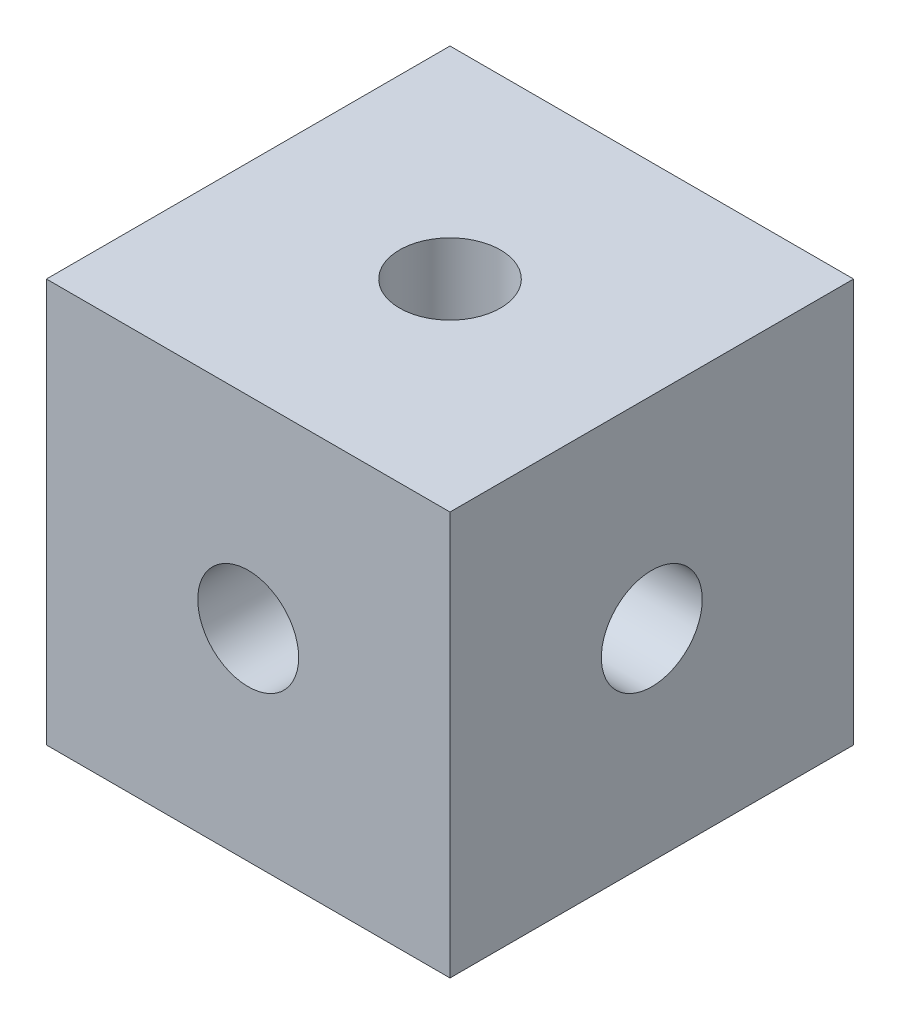
ISO-10303-21;
HEADER;
FILE_DESCRIPTION(('STEP AP214'),'2;1');
FILE_NAME('part.step','',(''),(''),'','','');
FILE_SCHEMA(('AUTOMOTIVE_DESIGN { 1 0 10303 214 1 1 1 1 }'));
ENDSEC;
DATA;
#1=APPLICATION_CONTEXT('core data for automotive mechanical design processes');
#2=APPLICATION_PROTOCOL_DEFINITION('international standard','automotive_design',2000,#1);
#3=PRODUCT_CONTEXT('',#1,'mechanical');
#4=PRODUCT('Part','Part','',(#3));
#5=PRODUCT_RELATED_PRODUCT_CATEGORY('part','',(#4));
#6=PRODUCT_DEFINITION_FORMATION('','',#4);
#7=PRODUCT_DEFINITION_CONTEXT('part definition',#1,'design');
#8=PRODUCT_DEFINITION('design','',#6,#7);
#9=PRODUCT_DEFINITION_SHAPE('','',#8);
#10=(LENGTH_UNIT() NAMED_UNIT(*) SI_UNIT(.MILLI.,.METRE.));
#11=(NAMED_UNIT(*) PLANE_ANGLE_UNIT() SI_UNIT($,.RADIAN.));
#12=(NAMED_UNIT(*) SI_UNIT($,.STERADIAN.) SOLID_ANGLE_UNIT());
#13=UNCERTAINTY_MEASURE_WITH_UNIT(LENGTH_MEASURE(1.E-05),#10,'distance_accuracy_value','');
#14=(GEOMETRIC_REPRESENTATION_CONTEXT(3) GLOBAL_UNCERTAINTY_ASSIGNED_CONTEXT((#13)) GLOBAL_UNIT_ASSIGNED_CONTEXT((#10,
#11,#12)) REPRESENTATION_CONTEXT('',''));
#15=CARTESIAN_POINT('',(0.,0.,0.));
#16=DIRECTION('',(0.,0.,1.));
#17=DIRECTION('',(1.,0.,0.));
#18=AXIS2_PLACEMENT_3D('',#15,#16,#17);
#19=CARTESIAN_POINT('',(5.,0.,0.));
#20=DIRECTION('',(1.,0.,0.));
#21=DIRECTION('',(0.,0.,-1.));
#22=AXIS2_PLACEMENT_3D('',#19,#20,#21);
#23=CYLINDRICAL_SURFACE('',#22,1.25);
#24=CARTESIAN_POINT('',(5.,0.,0.));
#25=DIRECTION('',(1.,0.,0.));
#26=DIRECTION('',(0.,0.,-1.));
#27=AXIS2_PLACEMENT_3D('',#24,#25,#26);
#28=CIRCLE('',#27,1.25);
#29=CARTESIAN_POINT('',(5.,0.,-1.25));
#30=VERTEX_POINT('',#29);
#31=EDGE_CURVE('E156',#30,#30,#28,.T.);
#32=ORIENTED_EDGE('',*,*,#31,.T.);
#33=EDGE_LOOP('',(#32));
#34=FACE_BOUND('',#33,.T.);
#35=CARTESIAN_POINT('',(0.,0.,0.));
#36=DIRECTION('',(0.707106781186547,-0.707106781186547,0.));
#37=DIRECTION('',(0.707106781186547,0.707106781186547,0.));
#38=AXIS2_PLACEMENT_3D('',#35,#36,#37);
#39=ELLIPSE('',#38,1.76776695296637,1.25);
#40=CARTESIAN_POINT('',(0.883883476483183,0.883883476483183,0.883883476483183));
#41=VERTEX_POINT('',#40);
#42=CARTESIAN_POINT('',(0.883883476483183,0.883883476483183,-0.883883476483183));
#43=VERTEX_POINT('',#42);
#44=EDGE_CURVE('E111',#41,#43,#39,.F.);
#45=ORIENTED_EDGE('',*,*,#44,.T.);
#46=CARTESIAN_POINT('',(0.,0.,0.));
#47=DIRECTION('',(0.707106781186547,0.,0.707106781186547));
#48=DIRECTION('',(0.707106781186547,0.,-0.707106781186547));
#49=AXIS2_PLACEMENT_3D('',#46,#47,#48);
#50=ELLIPSE('',#49,1.76776695296637,1.25);
#51=CARTESIAN_POINT('',(0.883883476483183,-0.883883476483183,-0.883883476483183));
#52=VERTEX_POINT('',#51);
#53=EDGE_CURVE('E100',#43,#52,#50,.F.);
#54=ORIENTED_EDGE('',*,*,#53,.T.);
#55=CARTESIAN_POINT('',(0.,0.,0.));
#56=DIRECTION('',(0.707106781186547,0.707106781186547,0.));
#57=DIRECTION('',(0.707106781186547,-0.707106781186547,0.));
#58=AXIS2_PLACEMENT_3D('',#55,#56,#57);
#59=ELLIPSE('',#58,1.76776695296637,1.25);
#60=CARTESIAN_POINT('',(0.883883476483183,-0.883883476483183,0.883883476483183));
#61=VERTEX_POINT('',#60);
#62=EDGE_CURVE('E106',#52,#61,#59,.F.);
#63=ORIENTED_EDGE('',*,*,#62,.T.);
#64=CARTESIAN_POINT('',(0.,0.,0.));
#65=DIRECTION('',(0.707106781186547,0.,-0.707106781186547));
#66=DIRECTION('',(0.707106781186547,0.,0.707106781186547));
#67=AXIS2_PLACEMENT_3D('',#64,#65,#66);
#68=ELLIPSE('',#67,1.76776695296637,1.25);
#69=EDGE_CURVE('E52',#61,#41,#68,.F.);
#70=ORIENTED_EDGE('',*,*,#69,.T.);
#71=EDGE_LOOP('',(#45,#54,#63,#70));
#72=FACE_BOUND('',#71,.T.);
#73=ADVANCED_FACE('F37',(#34,#72),#23,.F.);
#74=CARTESIAN_POINT('',(5.,5.,-5.));
#75=DIRECTION('',(-1.,0.,0.));
#76=DIRECTION('',(0.,0.,1.));
#77=AXIS2_PLACEMENT_3D('',#74,#75,#76);
#78=PLANE('',#77);
#79=DIRECTION('',(0.,0.,-1.));
#80=VECTOR('',#79,1.);
#81=CARTESIAN_POINT('',(5.,-5.,-5.));
#82=LINE('',#81,#80);
#83=CARTESIAN_POINT('',(5.,-5.,5.));
#84=VERTEX_POINT('',#83);
#85=CARTESIAN_POINT('',(5.,-5.,-5.));
#86=VERTEX_POINT('',#85);
#87=EDGE_CURVE('E139',#84,#86,#82,.T.);
#88=ORIENTED_EDGE('',*,*,#87,.T.);
#89=DIRECTION('',(0.,-1.,0.));
#90=VECTOR('',#89,1.);
#91=CARTESIAN_POINT('',(5.,5.,-5.));
#92=LINE('',#91,#90);
#93=CARTESIAN_POINT('',(5.,5.,-5.));
#94=VERTEX_POINT('',#93);
#95=EDGE_CURVE('E129',#94,#86,#92,.T.);
#96=ORIENTED_EDGE('',*,*,#95,.F.);
#97=DIRECTION('',(0.,0.,-1.));
#98=VECTOR('',#97,1.);
#99=CARTESIAN_POINT('',(5.,5.,-5.));
#100=LINE('',#99,#98);
#101=CARTESIAN_POINT('',(5.,5.,5.));
#102=VERTEX_POINT('',#101);
#103=EDGE_CURVE('E148',#102,#94,#100,.T.);
#104=ORIENTED_EDGE('',*,*,#103,.F.);
#105=DIRECTION('',(0.,-1.,0.));
#106=VECTOR('',#105,1.);
#107=CARTESIAN_POINT('',(5.,5.,5.));
#108=LINE('',#107,#106);
#109=EDGE_CURVE('E126',#102,#84,#108,.T.);
#110=ORIENTED_EDGE('',*,*,#109,.T.);
#111=EDGE_LOOP('',(#88,#96,#104,#110));
#112=FACE_BOUND('',#111,.T.);
#113=ORIENTED_EDGE('',*,*,#31,.F.);
#114=EDGE_LOOP('',(#113));
#115=FACE_BOUND('',#114,.T.);
#116=ADVANCED_FACE('F194',(#112,#115),#78,.F.);
#117=CARTESIAN_POINT('',(-5.,5.,-5.));
#118=DIRECTION('',(1.,0.,0.));
#119=DIRECTION('',(0.,0.,-1.));
#120=AXIS2_PLACEMENT_3D('',#117,#118,#119);
#121=PLANE('',#120);
#122=CARTESIAN_POINT('',(-5.,0.,0.));
#123=DIRECTION('',(1.,0.,0.));
#124=DIRECTION('',(0.,0.,-1.));
#125=AXIS2_PLACEMENT_3D('',#122,#123,#124);
#126=CIRCLE('',#125,1.25);
#127=CARTESIAN_POINT('',(-5.,0.,-1.25));
#128=VERTEX_POINT('',#127);
#129=EDGE_CURVE('E146',#128,#128,#126,.T.);
#130=ORIENTED_EDGE('',*,*,#129,.T.);
#131=EDGE_LOOP('',(#130));
#132=FACE_BOUND('',#131,.T.);
#133=DIRECTION('',(0.,0.,1.));
#134=VECTOR('',#133,1.);
#135=CARTESIAN_POINT('',(-5.,-5.,-5.));
#136=LINE('',#135,#134);
#137=CARTESIAN_POINT('',(-5.,-5.,-5.));
#138=VERTEX_POINT('',#137);
#139=CARTESIAN_POINT('',(-5.,-5.,5.));
#140=VERTEX_POINT('',#139);
#141=EDGE_CURVE('E143',#138,#140,#136,.T.);
#142=ORIENTED_EDGE('',*,*,#141,.T.);
#143=DIRECTION('',(0.,-1.,0.));
#144=VECTOR('',#143,1.);
#145=CARTESIAN_POINT('',(-5.,5.,5.));
#146=LINE('',#145,#144);
#147=CARTESIAN_POINT('',(-5.,5.,5.));
#148=VERTEX_POINT('',#147);
#149=EDGE_CURVE('E123',#148,#140,#146,.T.);
#150=ORIENTED_EDGE('',*,*,#149,.F.);
#151=DIRECTION('',(0.,0.,1.));
#152=VECTOR('',#151,1.);
#153=CARTESIAN_POINT('',(-5.,5.,-5.));
#154=LINE('',#153,#152);
#155=CARTESIAN_POINT('',(-5.,5.,-5.));
#156=VERTEX_POINT('',#155);
#157=EDGE_CURVE('E138',#156,#148,#154,.T.);
#158=ORIENTED_EDGE('',*,*,#157,.F.);
#159=DIRECTION('',(0.,-1.,0.));
#160=VECTOR('',#159,1.);
#161=CARTESIAN_POINT('',(-5.,5.,-5.));
#162=LINE('',#161,#160);
#163=EDGE_CURVE('E132',#156,#138,#162,.T.);
#164=ORIENTED_EDGE('',*,*,#163,.T.);
#165=EDGE_LOOP('',(#142,#150,#158,#164));
#166=FACE_BOUND('',#165,.T.);
#167=ADVANCED_FACE('F39',(#132,#166),#121,.F.);
#168=CARTESIAN_POINT('',(5.,5.,5.));
#169=DIRECTION('',(0.,0.,-1.));
#170=DIRECTION('',(-1.,0.,0.));
#171=AXIS2_PLACEMENT_3D('',#168,#169,#170);
#172=PLANE('',#171);
#173=CARTESIAN_POINT('',(0.,0.,5.));
#174=DIRECTION('',(0.,0.,1.));
#175=DIRECTION('',(1.,0.,0.));
#176=AXIS2_PLACEMENT_3D('',#173,#174,#175);
#177=CIRCLE('',#176,1.25);
#178=CARTESIAN_POINT('',(1.25,0.,5.));
#179=VERTEX_POINT('',#178);
#180=EDGE_CURVE('E177',#179,#179,#177,.T.);
#181=ORIENTED_EDGE('',*,*,#180,.F.);
#182=EDGE_LOOP('',(#181));
#183=FACE_BOUND('',#182,.T.);
#184=DIRECTION('',(1.,0.,0.));
#185=VECTOR('',#184,1.);
#186=CARTESIAN_POINT('',(5.,-5.,5.));
#187=LINE('',#186,#185);
#188=EDGE_CURVE('E141',#140,#84,#187,.T.);
#189=ORIENTED_EDGE('',*,*,#188,.T.);
#190=ORIENTED_EDGE('',*,*,#109,.F.);
#191=DIRECTION('',(1.,0.,0.));
#192=VECTOR('',#191,1.);
#193=CARTESIAN_POINT('',(5.,5.,5.));
#194=LINE('',#193,#192);
#195=EDGE_CURVE('E150',#148,#102,#194,.T.);
#196=ORIENTED_EDGE('',*,*,#195,.F.);
#197=ORIENTED_EDGE('',*,*,#149,.T.);
#198=EDGE_LOOP('',(#189,#190,#196,#197));
#199=FACE_BOUND('',#198,.T.);
#200=ADVANCED_FACE('F183',(#183,#199),#172,.F.);
#201=CARTESIAN_POINT('',(5.,5.,-5.));
#202=DIRECTION('',(0.,0.,1.));
#203=DIRECTION('',(1.,0.,0.));
#204=AXIS2_PLACEMENT_3D('',#201,#202,#203);
#205=PLANE('',#204);
#206=CARTESIAN_POINT('',(0.,0.,-5.));
#207=DIRECTION('',(0.,0.,1.));
#208=DIRECTION('',(1.,0.,0.));
#209=AXIS2_PLACEMENT_3D('',#206,#207,#208);
#210=CIRCLE('',#209,1.25);
#211=CARTESIAN_POINT('',(1.25,0.,-5.));
#212=VERTEX_POINT('',#211);
#213=EDGE_CURVE('E174',#212,#212,#210,.T.);
#214=ORIENTED_EDGE('',*,*,#213,.T.);
#215=EDGE_LOOP('',(#214));
#216=FACE_BOUND('',#215,.T.);
#217=DIRECTION('',(-1.,0.,0.));
#218=VECTOR('',#217,1.);
#219=CARTESIAN_POINT('',(5.,-5.,-5.));
#220=LINE('',#219,#218);
#221=EDGE_CURVE('E136',#86,#138,#220,.T.);
#222=ORIENTED_EDGE('',*,*,#221,.T.);
#223=ORIENTED_EDGE('',*,*,#163,.F.);
#224=DIRECTION('',(-1.,0.,0.));
#225=VECTOR('',#224,1.);
#226=CARTESIAN_POINT('',(5.,5.,-5.));
#227=LINE('',#226,#225);
#228=EDGE_CURVE('E135',#94,#156,#227,.T.);
#229=ORIENTED_EDGE('',*,*,#228,.F.);
#230=ORIENTED_EDGE('',*,*,#95,.T.);
#231=EDGE_LOOP('',(#222,#223,#229,#230));
#232=FACE_BOUND('',#231,.T.);
#233=ADVANCED_FACE('F186',(#216,#232),#205,.F.);
#234=CARTESIAN_POINT('',(0.,5.,0.));
#235=DIRECTION('',(0.,-1.,0.));
#236=DIRECTION('',(0.,0.,-1.));
#237=AXIS2_PLACEMENT_3D('',#234,#235,#236);
#238=PLANE('',#237);
#239=CARTESIAN_POINT('',(0.,5.,0.));
#240=DIRECTION('',(0.,1.,0.));
#241=DIRECTION('',(0.,0.,1.));
#242=AXIS2_PLACEMENT_3D('',#239,#240,#241);
#243=CIRCLE('',#242,1.25);
#244=CARTESIAN_POINT('',(0.,5.,1.25));
#245=VERTEX_POINT('',#244);
#246=EDGE_CURVE('E162',#245,#245,#243,.T.);
#247=ORIENTED_EDGE('',*,*,#246,.F.);
#248=EDGE_LOOP('',(#247));
#249=FACE_BOUND('',#248,.T.);
#250=ORIENTED_EDGE('',*,*,#157,.T.);
#251=ORIENTED_EDGE('',*,*,#195,.T.);
#252=ORIENTED_EDGE('',*,*,#103,.T.);
#253=ORIENTED_EDGE('',*,*,#228,.T.);
#254=EDGE_LOOP('',(#250,#251,#252,#253));
#255=FACE_BOUND('',#254,.T.);
#256=ADVANCED_FACE('F205',(#249,#255),#238,.F.);
#257=CARTESIAN_POINT('',(0.,-5.,0.));
#258=DIRECTION('',(0.,-1.,0.));
#259=DIRECTION('',(0.,0.,-1.));
#260=AXIS2_PLACEMENT_3D('',#257,#258,#259);
#261=PLANE('',#260);
#262=CARTESIAN_POINT('',(0.,-5.,0.));
#263=DIRECTION('',(0.,1.,0.));
#264=DIRECTION('',(0.,0.,1.));
#265=AXIS2_PLACEMENT_3D('',#262,#263,#264);
#266=CIRCLE('',#265,1.25);
#267=CARTESIAN_POINT('',(0.,-5.,1.25));
#268=VERTEX_POINT('',#267);
#269=EDGE_CURVE('E159',#268,#268,#266,.T.);
#270=ORIENTED_EDGE('',*,*,#269,.T.);
#271=EDGE_LOOP('',(#270));
#272=FACE_BOUND('',#271,.T.);
#273=ORIENTED_EDGE('',*,*,#141,.F.);
#274=ORIENTED_EDGE('',*,*,#221,.F.);
#275=ORIENTED_EDGE('',*,*,#87,.F.);
#276=ORIENTED_EDGE('',*,*,#188,.F.);
#277=EDGE_LOOP('',(#273,#274,#275,#276));
#278=FACE_BOUND('',#277,.T.);
#279=ADVANCED_FACE('F198',(#272,#278),#261,.T.);
#280=CARTESIAN_POINT('',(0.,0.,0.));
#281=DIRECTION('',(0.707106781186547,0.707106781186547,0.));
#282=DIRECTION('',(0.707106781186547,-0.707106781186547,0.));
#283=AXIS2_PLACEMENT_3D('',#280,#281,#282);
#284=ELLIPSE('',#283,1.76776695296637,1.25);
#285=CARTESIAN_POINT('',(-0.883883476483183,0.883883476483183,-0.883883476483183));
#286=VERTEX_POINT('',#285);
#287=CARTESIAN_POINT('',(-0.883883476483183,0.883883476483183,0.883883476483183));
#288=VERTEX_POINT('',#287);
#289=EDGE_CURVE('E115',#286,#288,#284,.T.);
#290=ORIENTED_EDGE('',*,*,#289,.T.);
#291=CARTESIAN_POINT('',(0.,0.,0.));
#292=DIRECTION('',(0.707106781186547,0.,0.707106781186547));
#293=DIRECTION('',(0.707106781186547,0.,-0.707106781186547));
#294=AXIS2_PLACEMENT_3D('',#291,#292,#293);
#295=ELLIPSE('',#294,1.76776695296637,1.25);
#296=CARTESIAN_POINT('',(-0.883883476483183,-0.883883476483183,0.883883476483183));
#297=VERTEX_POINT('',#296);
#298=EDGE_CURVE('E169',#288,#297,#295,.T.);
#299=ORIENTED_EDGE('',*,*,#298,.T.);
#300=CARTESIAN_POINT('',(0.,0.,0.));
#301=DIRECTION('',(0.707106781186547,-0.707106781186547,0.));
#302=DIRECTION('',(0.707106781186547,0.707106781186547,0.));
#303=AXIS2_PLACEMENT_3D('',#300,#301,#302);
#304=ELLIPSE('',#303,1.76776695296637,1.25);
#305=CARTESIAN_POINT('',(-0.883883476483183,-0.883883476483183,-0.883883476483183));
#306=VERTEX_POINT('',#305);
#307=EDGE_CURVE('E118',#297,#306,#304,.T.);
#308=ORIENTED_EDGE('',*,*,#307,.T.);
#309=CARTESIAN_POINT('',(0.,0.,0.));
#310=DIRECTION('',(0.707106781186547,0.,-0.707106781186547));
#311=DIRECTION('',(0.707106781186547,0.,0.707106781186547));
#312=AXIS2_PLACEMENT_3D('',#309,#310,#311);
#313=ELLIPSE('',#312,1.76776695296637,1.25);
#314=EDGE_CURVE('E59',#306,#286,#313,.T.);
#315=ORIENTED_EDGE('',*,*,#314,.T.);
#316=EDGE_LOOP('',(#290,#299,#308,#315));
#317=FACE_BOUND('',#316,.T.);
#318=ORIENTED_EDGE('',*,*,#129,.F.);
#319=EDGE_LOOP('',(#318));
#320=FACE_BOUND('',#319,.T.);
#321=ADVANCED_FACE('F213',(#317,#320),#23,.F.);
#322=CARTESIAN_POINT('',(0.,5.,0.));
#323=DIRECTION('',(0.,1.,0.));
#324=DIRECTION('',(0.,0.,1.));
#325=AXIS2_PLACEMENT_3D('',#322,#323,#324);
#326=CYLINDRICAL_SURFACE('',#325,1.25);
#327=ORIENTED_EDGE('',*,*,#246,.T.);
#328=EDGE_LOOP('',(#327));
#329=FACE_BOUND('',#328,.T.);
#330=ORIENTED_EDGE('',*,*,#289,.F.);
#331=CARTESIAN_POINT('',(0.,0.,0.));
#332=DIRECTION('',(0.,0.707106781186547,0.707106781186547));
#333=DIRECTION('',(0.,0.707106781186547,-0.707106781186547));
#334=AXIS2_PLACEMENT_3D('',#331,#332,#333);
#335=ELLIPSE('',#334,1.76776695296637,1.25);
#336=EDGE_CURVE('E112',#286,#43,#335,.F.);
#337=ORIENTED_EDGE('',*,*,#336,.T.);
#338=ORIENTED_EDGE('',*,*,#44,.F.);
#339=CARTESIAN_POINT('',(0.,0.,0.));
#340=DIRECTION('',(0.,0.707106781186547,-0.707106781186547));
#341=DIRECTION('',(0.,0.707106781186547,0.707106781186547));
#342=AXIS2_PLACEMENT_3D('',#339,#340,#341);
#343=ELLIPSE('',#342,1.76776695296637,1.25);
#344=EDGE_CURVE('E165',#41,#288,#343,.F.);
#345=ORIENTED_EDGE('',*,*,#344,.T.);
#346=EDGE_LOOP('',(#330,#337,#338,#345));
#347=FACE_BOUND('',#346,.T.);
#348=ADVANCED_FACE('F228',(#329,#347),#326,.F.);
#349=ORIENTED_EDGE('',*,*,#269,.F.);
#350=EDGE_LOOP('',(#349));
#351=FACE_BOUND('',#350,.T.);
#352=ORIENTED_EDGE('',*,*,#307,.F.);
#353=CARTESIAN_POINT('',(0.,0.,0.));
#354=DIRECTION('',(0.,0.707106781186547,0.707106781186547));
#355=DIRECTION('',(0.,0.707106781186547,-0.707106781186547));
#356=AXIS2_PLACEMENT_3D('',#353,#354,#355);
#357=ELLIPSE('',#356,1.76776695296637,1.25);
#358=EDGE_CURVE('E11',#297,#61,#357,.T.);
#359=ORIENTED_EDGE('',*,*,#358,.T.);
#360=ORIENTED_EDGE('',*,*,#62,.F.);
#361=CARTESIAN_POINT('',(0.,0.,0.));
#362=DIRECTION('',(0.,0.707106781186547,-0.707106781186547));
#363=DIRECTION('',(0.,0.707106781186547,0.707106781186547));
#364=AXIS2_PLACEMENT_3D('',#361,#362,#363);
#365=ELLIPSE('',#364,1.76776695296637,1.25);
#366=EDGE_CURVE('E45',#52,#306,#365,.T.);
#367=ORIENTED_EDGE('',*,*,#366,.T.);
#368=EDGE_LOOP('',(#352,#359,#360,#367));
#369=FACE_BOUND('',#368,.T.);
#370=ADVANCED_FACE('F114',(#351,#369),#326,.F.);
#371=CARTESIAN_POINT('',(0.,0.,5.));
#372=DIRECTION('',(0.,0.,1.));
#373=DIRECTION('',(1.,0.,0.));
#374=AXIS2_PLACEMENT_3D('',#371,#372,#373);
#375=CYLINDRICAL_SURFACE('',#374,1.25);
#376=ORIENTED_EDGE('',*,*,#213,.F.);
#377=EDGE_LOOP('',(#376));
#378=FACE_BOUND('',#377,.T.);
#379=ORIENTED_EDGE('',*,*,#314,.F.);
#380=ORIENTED_EDGE('',*,*,#366,.F.);
#381=ORIENTED_EDGE('',*,*,#53,.F.);
#382=ORIENTED_EDGE('',*,*,#336,.F.);
#383=EDGE_LOOP('',(#379,#380,#381,#382));
#384=FACE_BOUND('',#383,.T.);
#385=ADVANCED_FACE('F99',(#378,#384),#375,.F.);
#386=ORIENTED_EDGE('',*,*,#180,.T.);
#387=EDGE_LOOP('',(#386));
#388=FACE_BOUND('',#387,.T.);
#389=ORIENTED_EDGE('',*,*,#69,.F.);
#390=ORIENTED_EDGE('',*,*,#358,.F.);
#391=ORIENTED_EDGE('',*,*,#298,.F.);
#392=ORIENTED_EDGE('',*,*,#344,.F.);
#393=EDGE_LOOP('',(#389,#390,#391,#392));
#394=FACE_BOUND('',#393,.T.);
#395=ADVANCED_FACE('F181',(#388,#394),#375,.F.);
#396=CLOSED_SHELL('',(#73,#116,#167,#200,#233,#256,#279,#321,#348,#370,#385,#395));
#397=MANIFOLD_SOLID_BREP('B2',#396);
#398=ADVANCED_BREP_SHAPE_REPRESENTATION('',(#18,#397),#14);
#399=SHAPE_DEFINITION_REPRESENTATION(#9,#398);
ENDSEC;
END-ISO-10303-21;
